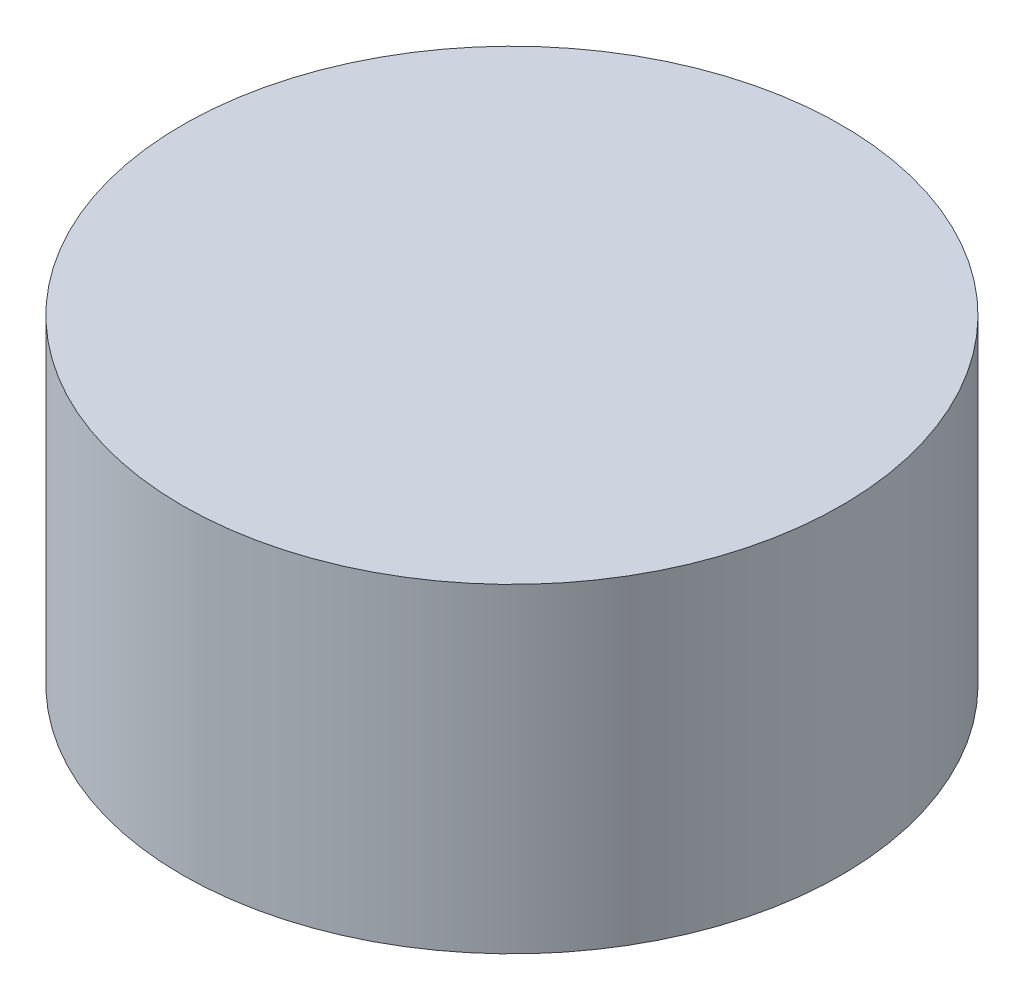
ISO-10303-21;
HEADER;
FILE_DESCRIPTION(('STEP AP214'),'2;1');
FILE_NAME('part.step','',(''),(''),'','','');
FILE_SCHEMA(('AUTOMOTIVE_DESIGN { 1 0 10303 214 1 1 1 1 }'));
ENDSEC;
DATA;
#1=APPLICATION_CONTEXT('core data for automotive mechanical design processes');
#2=APPLICATION_PROTOCOL_DEFINITION('international standard','automotive_design',2000,#1);
#3=PRODUCT_CONTEXT('',#1,'mechanical');
#4=PRODUCT('Part','Part','',(#3));
#5=PRODUCT_RELATED_PRODUCT_CATEGORY('part','',(#4));
#6=PRODUCT_DEFINITION_FORMATION('','',#4);
#7=PRODUCT_DEFINITION_CONTEXT('part definition',#1,'design');
#8=PRODUCT_DEFINITION('design','',#6,#7);
#9=PRODUCT_DEFINITION_SHAPE('','',#8);
#10=(LENGTH_UNIT() NAMED_UNIT(*) SI_UNIT(.MILLI.,.METRE.));
#11=(NAMED_UNIT(*) PLANE_ANGLE_UNIT() SI_UNIT($,.RADIAN.));
#12=(NAMED_UNIT(*) SI_UNIT($,.STERADIAN.) SOLID_ANGLE_UNIT());
#13=UNCERTAINTY_MEASURE_WITH_UNIT(LENGTH_MEASURE(1.E-05),#10,'distance_accuracy_value','');
#14=(GEOMETRIC_REPRESENTATION_CONTEXT(3) GLOBAL_UNCERTAINTY_ASSIGNED_CONTEXT((#13)) GLOBAL_UNIT_ASSIGNED_CONTEXT((#10,
#11,#12)) REPRESENTATION_CONTEXT('',''));
#15=CARTESIAN_POINT('',(0.,0.,0.));
#16=DIRECTION('',(0.,0.,1.));
#17=DIRECTION('',(1.,0.,0.));
#18=AXIS2_PLACEMENT_3D('',#15,#16,#17);
#19=CARTESIAN_POINT('',(0.,30.,0.));
#20=DIRECTION('',(0.,-1.,0.));
#21=DIRECTION('',(0.,0.,-1.));
#22=AXIS2_PLACEMENT_3D('',#19,#20,#21);
#23=CYLINDRICAL_SURFACE('',#22,30.9);
#24=CARTESIAN_POINT('',(0.,30.,0.));
#25=DIRECTION('',(0.,1.,0.));
#26=DIRECTION('',(0.,0.,1.));
#27=AXIS2_PLACEMENT_3D('',#24,#25,#26);
#28=CIRCLE('',#27,30.9);
#29=CARTESIAN_POINT('',(0.,30.,30.9));
#30=VERTEX_POINT('',#29);
#31=EDGE_CURVE('E10',#30,#30,#28,.T.);
#32=ORIENTED_EDGE('',*,*,#31,.F.);
#33=EDGE_LOOP('',(#32));
#34=FACE_BOUND('',#33,.T.);
#35=CARTESIAN_POINT('',(0.,0.,0.));
#36=DIRECTION('',(0.,1.,0.));
#37=DIRECTION('',(0.,0.,1.));
#38=AXIS2_PLACEMENT_3D('',#35,#36,#37);
#39=CIRCLE('',#38,30.9);
#40=CARTESIAN_POINT('',(0.,0.,30.9));
#41=VERTEX_POINT('',#40);
#42=EDGE_CURVE('E36',#41,#41,#39,.T.);
#43=ORIENTED_EDGE('',*,*,#42,.T.);
#44=EDGE_LOOP('',(#43));
#45=FACE_BOUND('',#44,.T.);
#46=ADVANCED_FACE('F33',(#34,#45),#23,.T.);
#47=CARTESIAN_POINT('',(0.,30.,0.));
#48=DIRECTION('',(0.,1.,0.));
#49=DIRECTION('',(0.,0.,1.));
#50=AXIS2_PLACEMENT_3D('',#47,#48,#49);
#51=PLANE('',#50);
#52=ORIENTED_EDGE('',*,*,#31,.T.);
#53=EDGE_LOOP('',(#52));
#54=FACE_BOUND('',#53,.T.);
#55=ADVANCED_FACE('F51',(#54),#51,.T.);
#56=CARTESIAN_POINT('',(0.,0.,0.));
#57=DIRECTION('',(0.,1.,0.));
#58=DIRECTION('',(0.,0.,1.));
#59=AXIS2_PLACEMENT_3D('',#56,#57,#58);
#60=PLANE('',#59);
#61=ORIENTED_EDGE('',*,*,#42,.F.);
#62=EDGE_LOOP('',(#61));
#63=FACE_BOUND('',#62,.T.);
#64=ADVANCED_FACE('F49',(#63),#60,.F.);
#65=CLOSED_SHELL('',(#46,#55,#64));
#66=MANIFOLD_SOLID_BREP('B2',#65);
#67=ADVANCED_BREP_SHAPE_REPRESENTATION('',(#18,#66),#14);
#68=SHAPE_DEFINITION_REPRESENTATION(#9,#67);
ENDSEC;
END-ISO-10303-21;
